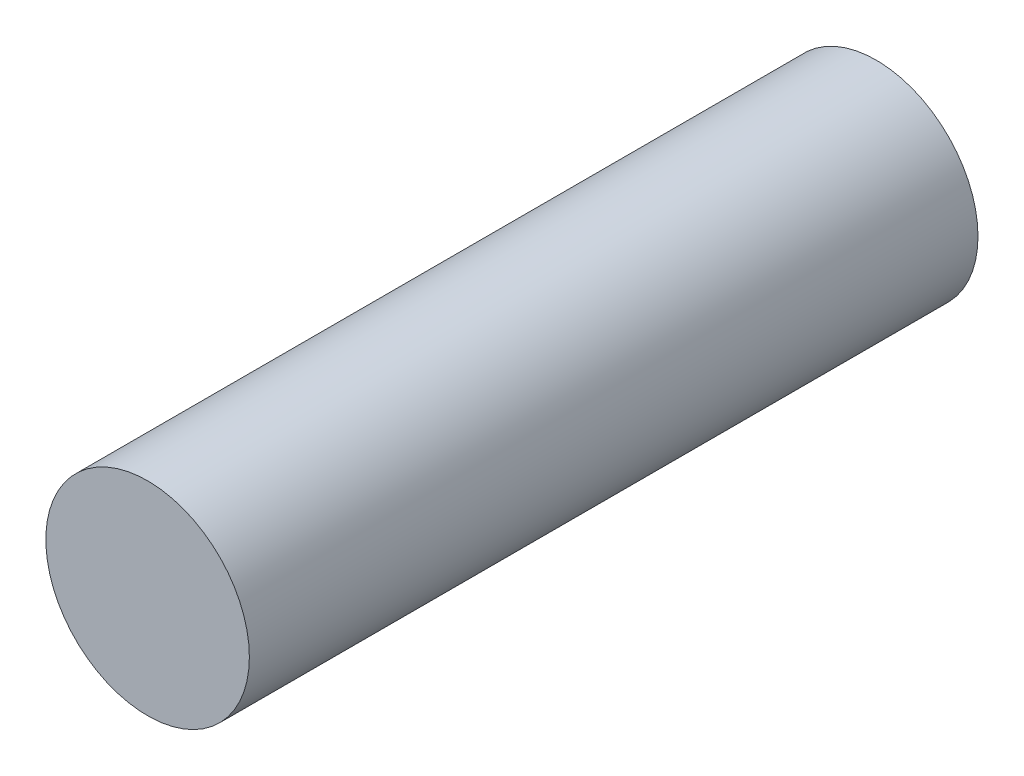
ISO-10303-21;
HEADER;
FILE_DESCRIPTION(('STEP AP214'),'2;1');
FILE_NAME('part.step','',(''),(''),'','','');
FILE_SCHEMA(('AUTOMOTIVE_DESIGN { 1 0 10303 214 1 1 1 1 }'));
ENDSEC;
DATA;
#1=APPLICATION_CONTEXT('core data for automotive mechanical design processes');
#2=APPLICATION_PROTOCOL_DEFINITION('international standard','automotive_design',2000,#1);
#3=PRODUCT_CONTEXT('',#1,'mechanical');
#4=PRODUCT('Part','Part','',(#3));
#5=PRODUCT_RELATED_PRODUCT_CATEGORY('part','',(#4));
#6=PRODUCT_DEFINITION_FORMATION('','',#4);
#7=PRODUCT_DEFINITION_CONTEXT('part definition',#1,'design');
#8=PRODUCT_DEFINITION('design','',#6,#7);
#9=PRODUCT_DEFINITION_SHAPE('','',#8);
#10=(LENGTH_UNIT() NAMED_UNIT(*) SI_UNIT(.MILLI.,.METRE.));
#11=(NAMED_UNIT(*) PLANE_ANGLE_UNIT() SI_UNIT($,.RADIAN.));
#12=(NAMED_UNIT(*) SI_UNIT($,.STERADIAN.) SOLID_ANGLE_UNIT());
#13=UNCERTAINTY_MEASURE_WITH_UNIT(LENGTH_MEASURE(1.E-05),#10,'distance_accuracy_value','');
#14=(GEOMETRIC_REPRESENTATION_CONTEXT(3) GLOBAL_UNCERTAINTY_ASSIGNED_CONTEXT((#13)) GLOBAL_UNIT_ASSIGNED_CONTEXT((#10,
#11,#12)) REPRESENTATION_CONTEXT('',''));
#15=CARTESIAN_POINT('',(0.,0.,0.));
#16=DIRECTION('',(0.,0.,1.));
#17=DIRECTION('',(1.,0.,0.));
#18=AXIS2_PLACEMENT_3D('',#15,#16,#17);
#19=CARTESIAN_POINT('',(0.,0.,64.8));
#20=DIRECTION('',(0.,0.,-1.));
#21=DIRECTION('',(-1.,0.,0.));
#22=AXIS2_PLACEMENT_3D('',#19,#20,#21);
#23=CYLINDRICAL_SURFACE('',#22,9.05);
#24=CARTESIAN_POINT('',(0.,0.,64.8));
#25=DIRECTION('',(0.,0.,1.));
#26=DIRECTION('',(1.,0.,0.));
#27=AXIS2_PLACEMENT_3D('',#24,#25,#26);
#28=CIRCLE('',#27,9.05);
#29=CARTESIAN_POINT('',(9.05,0.,64.8));
#30=VERTEX_POINT('',#29);
#31=EDGE_CURVE('E10',#30,#30,#28,.T.);
#32=ORIENTED_EDGE('',*,*,#31,.F.);
#33=EDGE_LOOP('',(#32));
#34=FACE_BOUND('',#33,.T.);
#35=CARTESIAN_POINT('',(0.,0.,0.));
#36=DIRECTION('',(0.,0.,1.));
#37=DIRECTION('',(1.,0.,0.));
#38=AXIS2_PLACEMENT_3D('',#35,#36,#37);
#39=CIRCLE('',#38,9.05);
#40=CARTESIAN_POINT('',(9.05,0.,0.));
#41=VERTEX_POINT('',#40);
#42=EDGE_CURVE('E33',#41,#41,#39,.T.);
#43=ORIENTED_EDGE('',*,*,#42,.T.);
#44=EDGE_LOOP('',(#43));
#45=FACE_BOUND('',#44,.T.);
#46=ADVANCED_FACE('F30',(#34,#45),#23,.T.);
#47=CARTESIAN_POINT('',(0.,0.,64.8));
#48=DIRECTION('',(0.,0.,1.));
#49=DIRECTION('',(1.,0.,0.));
#50=AXIS2_PLACEMENT_3D('',#47,#48,#49);
#51=PLANE('',#50);
#52=ORIENTED_EDGE('',*,*,#31,.T.);
#53=EDGE_LOOP('',(#52));
#54=FACE_BOUND('',#53,.T.);
#55=ADVANCED_FACE('F45',(#54),#51,.T.);
#56=CARTESIAN_POINT('',(0.,0.,0.));
#57=DIRECTION('',(0.,0.,1.));
#58=DIRECTION('',(1.,0.,0.));
#59=AXIS2_PLACEMENT_3D('',#56,#57,#58);
#60=PLANE('',#59);
#61=ORIENTED_EDGE('',*,*,#42,.F.);
#62=EDGE_LOOP('',(#61));
#63=FACE_BOUND('',#62,.T.);
#64=ADVANCED_FACE('F43',(#63),#60,.F.);
#65=CLOSED_SHELL('',(#46,#55,#64));
#66=MANIFOLD_SOLID_BREP('B2',#65);
#67=ADVANCED_BREP_SHAPE_REPRESENTATION('',(#18,#66),#14);
#68=SHAPE_DEFINITION_REPRESENTATION(#9,#67);
ENDSEC;
END-ISO-10303-21;
